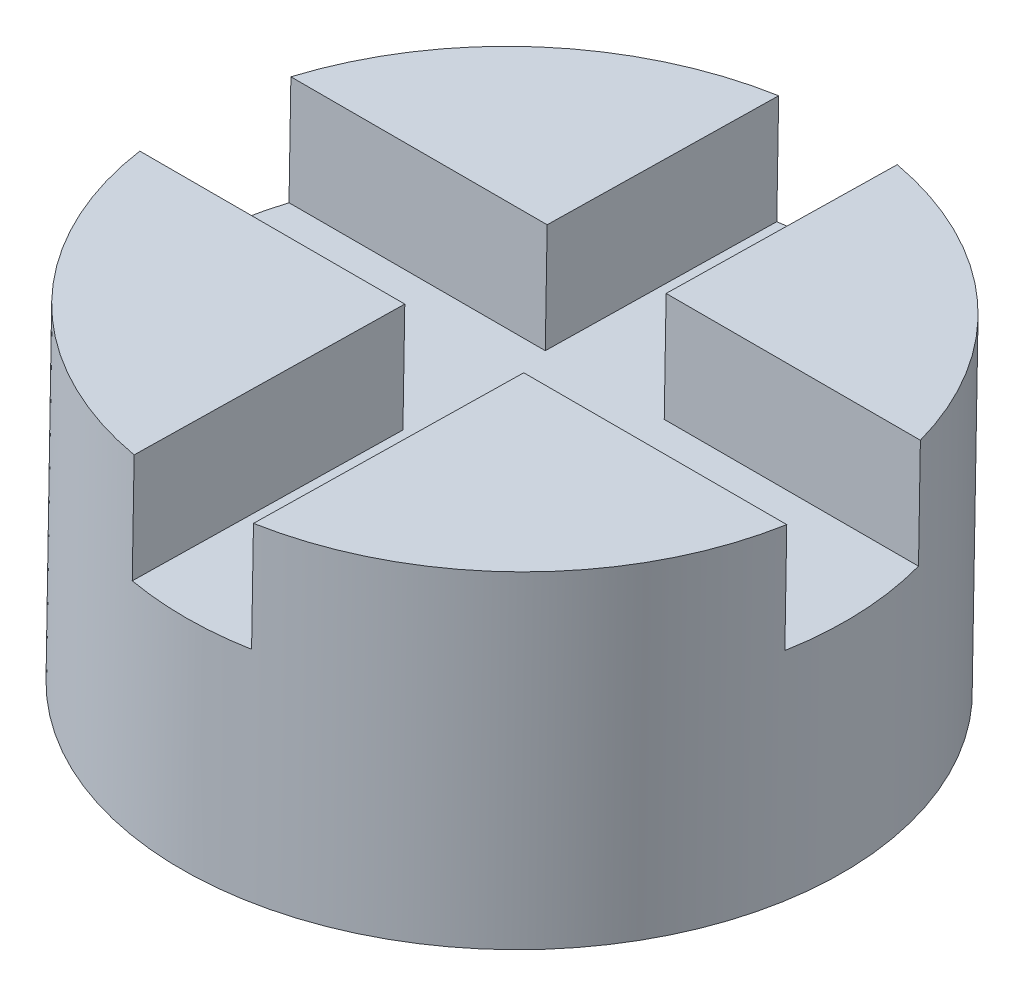
ISO-10303-21;
HEADER;
FILE_DESCRIPTION(('STEP AP214'),'2;1');
FILE_NAME('part.step','',(''),(''),'','','');
FILE_SCHEMA(('AUTOMOTIVE_DESIGN { 1 0 10303 214 1 1 1 1 }'));
ENDSEC;
DATA;
#1=APPLICATION_CONTEXT('core data for automotive mechanical design processes');
#2=APPLICATION_PROTOCOL_DEFINITION('international standard','automotive_design',2000,#1);
#3=PRODUCT_CONTEXT('',#1,'mechanical');
#4=PRODUCT('Part','Part','',(#3));
#5=PRODUCT_RELATED_PRODUCT_CATEGORY('part','',(#4));
#6=PRODUCT_DEFINITION_FORMATION('','',#4);
#7=PRODUCT_DEFINITION_CONTEXT('part definition',#1,'design');
#8=PRODUCT_DEFINITION('design','',#6,#7);
#9=PRODUCT_DEFINITION_SHAPE('','',#8);
#10=(LENGTH_UNIT() NAMED_UNIT(*) SI_UNIT(.MILLI.,.METRE.));
#11=(NAMED_UNIT(*) PLANE_ANGLE_UNIT() SI_UNIT($,.RADIAN.));
#12=(NAMED_UNIT(*) SI_UNIT($,.STERADIAN.) SOLID_ANGLE_UNIT());
#13=UNCERTAINTY_MEASURE_WITH_UNIT(LENGTH_MEASURE(1.E-05),#10,'distance_accuracy_value','');
#14=(GEOMETRIC_REPRESENTATION_CONTEXT(3) GLOBAL_UNCERTAINTY_ASSIGNED_CONTEXT((#13)) GLOBAL_UNIT_ASSIGNED_CONTEXT((#10,
#11,#12)) REPRESENTATION_CONTEXT('',''));
#15=CARTESIAN_POINT('',(0.,0.,0.));
#16=DIRECTION('',(0.,0.,1.));
#17=DIRECTION('',(1.,0.,0.));
#18=AXIS2_PLACEMENT_3D('',#15,#16,#17);
#19=CARTESIAN_POINT('',(0.,42.7310366721,-0.7458730195362));
#20=DIRECTION('',(0.,0.999847695156402,-0.01745240643669));
#21=DIRECTION('',(0.,0.01745240643669,0.999847695156402));
#22=AXIS2_PLACEMENT_3D('',#19,#20,#21);
#23=PLANE('',#22);
#24=DIRECTION('',(1.,0.,0.));
#25=VECTOR('',#24,1.);
#26=CARTESIAN_POINT('',(88.15,42.50416011332,-13.7436223674126));
#27=LINE('',#26,#25);
#28=CARTESIAN_POINT('',(88.15,42.50416011332,-13.7436223674109));
#29=VERTEX_POINT('',#28);
#30=CARTESIAN_POINT('',(85.7803241392514,42.5041601133196,-13.7436223674126));
#31=VERTEX_POINT('',#30);
#32=EDGE_CURVE('E183',#29,#31,#27,.F.);
#33=ORIENTED_EDGE('',*,*,#32,.T.);
#34=CARTESIAN_POINT('',(88.69069436393,42.5188085060638,-12.9044165093134));
#35=DIRECTION('',(0.,-0.999847695156402,0.01745240643669));
#36=DIRECTION('',(0.,-0.01745240643669,-0.999847695156402));
#37=AXIS2_PLACEMENT_3D('',#34,#35,#36);
#38=CIRCLE('',#37,3.02898264973);
#39=CARTESIAN_POINT('',(85.6995442590228,42.52713747285,-12.4272503216927));
#40=VERTEX_POINT('',#39);
#41=EDGE_CURVE('E228',#31,#40,#38,.F.);
#42=ORIENTED_EDGE('',*,*,#41,.T.);
#43=DIRECTION('',(1.,0.,0.));
#44=VECTOR('',#43,1.);
#45=CARTESIAN_POINT('',(85.57217889833,42.52713747285,-12.4272503216927));
#46=LINE('',#45,#44);
#47=CARTESIAN_POINT('',(88.15,42.52713747285,-12.4272503216927));
#48=VERTEX_POINT('',#47);
#49=EDGE_CURVE('E187',#40,#48,#46,.T.);
#50=ORIENTED_EDGE('',*,*,#49,.T.);
#51=DIRECTION('',(0.,0.0174524064389067,0.999847695156363));
#52=VECTOR('',#51,1.);
#53=CARTESIAN_POINT('',(88.15,42.52713747285,-12.42725032169));
#54=LINE('',#53,#52);
#55=CARTESIAN_POINT('',(88.15,42.5708224909701,-9.92453730999004));
#56=VERTEX_POINT('',#55);
#57=EDGE_CURVE('E195',#48,#56,#54,.T.);
#58=ORIENTED_EDGE('',*,*,#57,.T.);
#59=CARTESIAN_POINT('',(88.69069436393,42.5188085060661,-12.9044165093134));
#60=DIRECTION('',(0.,-0.999847695156402,0.01745240643669));
#61=DIRECTION('',(0.,-0.01745240643669,-0.999847695156402));
#62=AXIS2_PLACEMENT_3D('',#59,#60,#61);
#63=CIRCLE('',#62,3.02898264973);
#64=CARTESIAN_POINT('',(89.25,42.5707625146614,-9.9279733503033));
#65=VERTEX_POINT('',#64);
#66=EDGE_CURVE('E19',#56,#65,#63,.F.);
#67=ORIENTED_EDGE('',*,*,#66,.T.);
#68=DIRECTION('',(0.,-0.0174524064376192,-0.999847695156385));
#69=VECTOR('',#68,1.);
#70=CARTESIAN_POINT('',(89.25,42.57076251466,-9.927973350303));
#71=LINE('',#70,#69);
#72=CARTESIAN_POINT('',(89.25,42.52713747285,-12.4272503216909));
#73=VERTEX_POINT('',#72);
#74=EDGE_CURVE('E198',#65,#73,#71,.T.);
#75=ORIENTED_EDGE('',*,*,#74,.T.);
#76=DIRECTION('',(1.,0.,0.));
#77=VECTOR('',#76,1.);
#78=CARTESIAN_POINT('',(89.25,42.52713747285,-12.4272503216927));
#79=LINE('',#78,#77);
#80=CARTESIAN_POINT('',(91.6818444688322,42.527137472848,-12.4272503216927));
#81=VERTEX_POINT('',#80);
#82=EDGE_CURVE('E91',#73,#81,#79,.T.);
#83=ORIENTED_EDGE('',*,*,#82,.T.);
#84=CARTESIAN_POINT('',(88.69069436393,42.5188085060607,-12.9044165093133));
#85=DIRECTION('',(0.,-0.999847695156402,0.01745240643669));
#86=DIRECTION('',(0.,-0.01745240643669,-0.999847695156402));
#87=AXIS2_PLACEMENT_3D('',#84,#85,#86);
#88=CIRCLE('',#87,3.02898264973);
#89=CARTESIAN_POINT('',(91.6010645886036,42.50416011332,-13.7436223674126));
#90=VERTEX_POINT('',#89);
#91=EDGE_CURVE('E243',#81,#90,#88,.F.);
#92=ORIENTED_EDGE('',*,*,#91,.T.);
#93=DIRECTION('',(1.,0.,0.));
#94=VECTOR('',#93,1.);
#95=CARTESIAN_POINT('',(91.77834829332,42.50416011332,-13.7436223674126));
#96=LINE('',#95,#94);
#97=CARTESIAN_POINT('',(89.25,42.50416011332,-13.7436223674126));
#98=VERTEX_POINT('',#97);
#99=EDGE_CURVE('E129',#90,#98,#96,.F.);
#100=ORIENTED_EDGE('',*,*,#99,.T.);
#101=DIRECTION('',(0.,-0.017452406435228,-0.999847695156427));
#102=VECTOR('',#101,1.);
#103=CARTESIAN_POINT('',(89.25,42.50416011332,-13.74362236741));
#104=LINE('',#103,#102);
#105=CARTESIAN_POINT('',(89.25,42.466854497469,-15.8808596683216));
#106=VERTEX_POINT('',#105);
#107=EDGE_CURVE('E126',#98,#106,#104,.T.);
#108=ORIENTED_EDGE('',*,*,#107,.T.);
#109=CARTESIAN_POINT('',(88.69069436393,42.5188085060607,-12.9044165093133));
#110=DIRECTION('',(0.,-0.999847695156402,0.01745240643669));
#111=DIRECTION('',(0.,-0.01745240643669,-0.999847695156402));
#112=AXIS2_PLACEMENT_3D('',#109,#110,#111);
#113=CIRCLE('',#112,3.02898264973);
#114=CARTESIAN_POINT('',(88.15,42.46679452116,-15.8842957086379));
#115=VERTEX_POINT('',#114);
#116=EDGE_CURVE('E242',#106,#115,#113,.F.);
#117=ORIENTED_EDGE('',*,*,#116,.T.);
#118=DIRECTION('',(0.,0.0174524064366882,0.999847695156402));
#119=VECTOR('',#118,1.);
#120=CARTESIAN_POINT('',(88.15,42.46679452116,-15.88429570864));
#121=LINE('',#120,#119);
#122=EDGE_CURVE('E175',#115,#29,#121,.T.);
#123=ORIENTED_EDGE('',*,*,#122,.T.);
#124=EDGE_LOOP('',(#33,#42,#50,#58,#67,#75,#83,#92,#100,#108,#117,#123));
#125=FACE_BOUND('',#124,.T.);
#126=ADVANCED_FACE('F16',(#125),#23,.T.);
#127=CARTESIAN_POINT('',(89.25,44.13214754147,-12.45526587665));
#128=DIRECTION('',(0.,0.01745240643669,0.999847695156402));
#129=DIRECTION('',(0.,-0.999847695156402,0.01745240643669));
#130=AXIS2_PLACEMENT_3D('',#127,#128,#129);
#131=PLANE('',#130);
#132=ORIENTED_EDGE('',*,*,#82,.F.);
#133=DIRECTION('',(0.,0.999847695156345,-0.0174524064399371));
#134=VECTOR('',#133,1.);
#135=CARTESIAN_POINT('',(89.25,42.52713747285,-12.42725032169));
#136=LINE('',#135,#134);
#137=CARTESIAN_POINT('',(89.25,43.5269851680068,-12.4447027281299));
#138=VERTEX_POINT('',#137);
#139=EDGE_CURVE('E200',#73,#138,#136,.T.);
#140=ORIENTED_EDGE('',*,*,#139,.T.);
#141=DIRECTION('',(1.,0.,0.));
#142=VECTOR('',#141,1.);
#143=CARTESIAN_POINT('',(0.,43.5269851680068,-12.4447027281299));
#144=LINE('',#143,#142);
#145=CARTESIAN_POINT('',(91.6818444688322,43.5269851680084,-12.4447027281298));
#146=VERTEX_POINT('',#145);
#147=EDGE_CURVE('E128',#146,#138,#144,.F.);
#148=ORIENTED_EDGE('',*,*,#147,.F.);
#149=DIRECTION('',(0.,-0.999847695156402,0.01745240643669));
#150=VECTOR('',#149,1.);
#151=CARTESIAN_POINT('',(91.68184446883,44.13214754147,-12.45526587665));
#152=LINE('',#151,#150);
#153=EDGE_CURVE('E199',#81,#146,#152,.F.);
#154=ORIENTED_EDGE('',*,*,#153,.F.);
#155=EDGE_LOOP('',(#132,#140,#148,#154));
#156=FACE_BOUND('',#155,.T.);
#157=ADVANCED_FACE('F255',(#156),#131,.F.);
#158=CARTESIAN_POINT('',(89.25,44.17865705882,-9.790737412431));
#159=DIRECTION('',(1.,0.,0.));
#160=DIRECTION('',(0.,0.,-1.));
#161=AXIS2_PLACEMENT_3D('',#158,#159,#160);
#162=PLANE('',#161);
#163=ORIENTED_EDGE('',*,*,#74,.F.);
#164=DIRECTION('',(0.,-0.999847695156394,0.0174524064371114));
#165=VECTOR('',#164,1.);
#166=CARTESIAN_POINT('',(89.25,43.57061020981,-9.94542575674));
#167=LINE('',#166,#165);
#168=CARTESIAN_POINT('',(89.25,43.5706102098161,-9.94542575674011));
#169=VERTEX_POINT('',#168);
#170=EDGE_CURVE('E196',#169,#65,#167,.T.);
#171=ORIENTED_EDGE('',*,*,#170,.F.);
#172=DIRECTION('',(0.,0.01745240643669,0.999847695156402));
#173=VECTOR('',#172,1.);
#174=CARTESIAN_POINT('',(89.25,43.73088436726,-0.7633254259729));
#175=LINE('',#174,#173);
#176=EDGE_CURVE('E157',#138,#169,#175,.T.);
#177=ORIENTED_EDGE('',*,*,#176,.F.);
#178=ORIENTED_EDGE('',*,*,#139,.F.);
#179=EDGE_LOOP('',(#163,#171,#177,#178));
#180=FACE_BOUND('',#179,.T.);
#181=ADVANCED_FACE('F247',(#180),#162,.F.);
#182=CARTESIAN_POINT('',(88.15,44.13214754147,-12.45526587665));
#183=DIRECTION('',(-1.,0.,0.));
#184=DIRECTION('',(0.,0.,1.));
#185=AXIS2_PLACEMENT_3D('',#182,#183,#184);
#186=PLANE('',#185);
#187=ORIENTED_EDGE('',*,*,#57,.F.);
#188=DIRECTION('',(0.,-0.999847695156402,0.01745240643669));
#189=VECTOR('',#188,1.);
#190=CARTESIAN_POINT('',(88.15,44.13214754147,-12.45526587665));
#191=LINE('',#190,#189);
#192=CARTESIAN_POINT('',(88.15,43.5269851680068,-12.4447027281298));
#193=VERTEX_POINT('',#192);
#194=EDGE_CURVE('E189',#48,#193,#191,.F.);
#195=ORIENTED_EDGE('',*,*,#194,.T.);
#196=DIRECTION('',(0.,0.01745240643669,0.999847695156402));
#197=VECTOR('',#196,1.);
#198=CARTESIAN_POINT('',(88.15,43.73088436726,-0.7633254259729));
#199=LINE('',#198,#197);
#200=CARTESIAN_POINT('',(88.15,43.5706701861206,-9.94198971642633));
#201=VERTEX_POINT('',#200);
#202=EDGE_CURVE('E153',#201,#193,#199,.F.);
#203=ORIENTED_EDGE('',*,*,#202,.F.);
#204=DIRECTION('',(0.,0.999847695156412,-0.0174524064361125));
#205=VECTOR('',#204,1.);
#206=CARTESIAN_POINT('',(88.15,42.57082249097,-9.924537309989));
#207=LINE('',#206,#205);
#208=EDGE_CURVE('E188',#56,#201,#207,.T.);
#209=ORIENTED_EDGE('',*,*,#208,.F.);
#210=EDGE_LOOP('',(#187,#195,#203,#209));
#211=FACE_BOUND('',#210,.T.);
#212=ADVANCED_FACE('F262',(#211),#186,.F.);
#213=CARTESIAN_POINT('',(85.57217889833,44.13214754147,-12.45526587665));
#214=DIRECTION('',(0.,0.01745240643669,0.999847695156402));
#215=DIRECTION('',(0.,-0.999847695156402,0.01745240643669));
#216=AXIS2_PLACEMENT_3D('',#213,#214,#215);
#217=PLANE('',#216);
#218=ORIENTED_EDGE('',*,*,#49,.F.);
#219=DIRECTION('',(0.,-0.999847695156402,0.01745240643669));
#220=VECTOR('',#219,1.);
#221=CARTESIAN_POINT('',(85.69954425902,44.13214754147,-12.45526587665));
#222=LINE('',#221,#220);
#223=CARTESIAN_POINT('',(85.6995442590228,43.5269851680061,-12.4447027281298));
#224=VERTEX_POINT('',#223);
#225=EDGE_CURVE('E184',#224,#40,#222,.T.);
#226=ORIENTED_EDGE('',*,*,#225,.F.);
#227=DIRECTION('',(1.,0.,0.));
#228=VECTOR('',#227,1.);
#229=CARTESIAN_POINT('',(0.,43.5269851680068,-12.4447027281299));
#230=LINE('',#229,#228);
#231=EDGE_CURVE('E148',#193,#224,#230,.F.);
#232=ORIENTED_EDGE('',*,*,#231,.F.);
#233=ORIENTED_EDGE('',*,*,#194,.F.);
#234=EDGE_LOOP('',(#218,#226,#232,#233));
#235=FACE_BOUND('',#234,.T.);
#236=ADVANCED_FACE('F297',(#235),#217,.F.);
#237=CARTESIAN_POINT('',(88.15,44.10917018195,-13.77163792237));
#238=DIRECTION('',(0.,-0.01745240643669,-0.999847695156402));
#239=DIRECTION('',(0.,0.999847695156402,-0.01745240643669));
#240=AXIS2_PLACEMENT_3D('',#237,#238,#239);
#241=PLANE('',#240);
#242=ORIENTED_EDGE('',*,*,#32,.F.);
#243=DIRECTION('',(0.,0.999847695156345,-0.0174524064399354));
#244=VECTOR('',#243,1.);
#245=CARTESIAN_POINT('',(88.15,42.50416011332,-13.74362236741));
#246=LINE('',#245,#244);
#247=CARTESIAN_POINT('',(88.15,43.5040078084798,-13.76107477385));
#248=VERTEX_POINT('',#247);
#249=EDGE_CURVE('E177',#29,#248,#246,.T.);
#250=ORIENTED_EDGE('',*,*,#249,.T.);
#251=DIRECTION('',(1.,0.,0.));
#252=VECTOR('',#251,1.);
#253=CARTESIAN_POINT('',(0.,43.5040078084798,-13.76107477385));
#254=LINE('',#253,#252);
#255=CARTESIAN_POINT('',(85.7803241392515,43.50400780848,-13.7610747738497));
#256=VERTEX_POINT('',#255);
#257=EDGE_CURVE('E144',#256,#248,#254,.T.);
#258=ORIENTED_EDGE('',*,*,#257,.F.);
#259=DIRECTION('',(0.,0.999847695156402,-0.01745240643669));
#260=VECTOR('',#259,1.);
#261=CARTESIAN_POINT('',(85.78032413925,44.10917018195,-13.77163792237));
#262=LINE('',#261,#260);
#263=EDGE_CURVE('E176',#31,#256,#262,.T.);
#264=ORIENTED_EDGE('',*,*,#263,.F.);
#265=EDGE_LOOP('',(#242,#250,#258,#264));
#266=FACE_BOUND('',#265,.T.);
#267=ADVANCED_FACE('F293',(#266),#241,.F.);
#268=CARTESIAN_POINT('',(88.15,44.06883212477,-16.08260367049));
#269=DIRECTION('',(-1.,0.,0.));
#270=DIRECTION('',(0.,0.,1.));
#271=AXIS2_PLACEMENT_3D('',#268,#269,#270);
#272=PLANE('',#271);
#273=ORIENTED_EDGE('',*,*,#122,.F.);
#274=DIRECTION('',(0.,-0.99984769515652,0.0174524064299377));
#275=VECTOR('',#274,1.);
#276=CARTESIAN_POINT('',(88.15,43.46664221632,-15.90174811507));
#277=LINE('',#276,#275);
#278=CARTESIAN_POINT('',(88.15,43.4666422163201,-15.9017481150713));
#279=VERTEX_POINT('',#278);
#280=EDGE_CURVE('E172',#279,#115,#277,.T.);
#281=ORIENTED_EDGE('',*,*,#280,.F.);
#282=DIRECTION('',(0.,0.01745240643669,0.999847695156402));
#283=VECTOR('',#282,1.);
#284=CARTESIAN_POINT('',(88.15,43.73088436726,-0.7633254259729));
#285=LINE('',#284,#283);
#286=EDGE_CURVE('E120',#248,#279,#285,.F.);
#287=ORIENTED_EDGE('',*,*,#286,.F.);
#288=ORIENTED_EDGE('',*,*,#249,.F.);
#289=EDGE_LOOP('',(#273,#281,#287,#288));
#290=FACE_BOUND('',#289,.T.);
#291=ADVANCED_FACE('F290',(#290),#272,.F.);
#292=CARTESIAN_POINT('',(89.25,44.10917018195,-13.77163792237));
#293=DIRECTION('',(1.,0.,0.));
#294=DIRECTION('',(0.,0.,-1.));
#295=AXIS2_PLACEMENT_3D('',#292,#293,#294);
#296=PLANE('',#295);
#297=ORIENTED_EDGE('',*,*,#107,.F.);
#298=DIRECTION('',(0.,0.999847695156402,-0.01745240643669));
#299=VECTOR('',#298,1.);
#300=CARTESIAN_POINT('',(89.25,44.10917018195,-13.77163792237));
#301=LINE('',#300,#299);
#302=CARTESIAN_POINT('',(89.25,43.5040078084798,-13.7610747738498));
#303=VERTEX_POINT('',#302);
#304=EDGE_CURVE('E123',#98,#303,#301,.T.);
#305=ORIENTED_EDGE('',*,*,#304,.T.);
#306=DIRECTION('',(0.,0.01745240643669,0.999847695156402));
#307=VECTOR('',#306,1.);
#308=CARTESIAN_POINT('',(89.25,43.73088436726,-0.7633254259729));
#309=LINE('',#308,#307);
#310=CARTESIAN_POINT('',(89.25,43.4667021926284,-15.89831207476));
#311=VERTEX_POINT('',#310);
#312=EDGE_CURVE('E113',#311,#303,#309,.T.);
#313=ORIENTED_EDGE('',*,*,#312,.F.);
#314=DIRECTION('',(0.,0.999847695156345,-0.017452406439937));
#315=VECTOR('',#314,1.);
#316=CARTESIAN_POINT('',(89.25,42.46685449747,-15.88085966832));
#317=LINE('',#316,#315);
#318=EDGE_CURVE('E167',#106,#311,#317,.T.);
#319=ORIENTED_EDGE('',*,*,#318,.F.);
#320=EDGE_LOOP('',(#297,#305,#313,#319));
#321=FACE_BOUND('',#320,.T.);
#322=ADVANCED_FACE('F124',(#321),#296,.F.);
#323=CARTESIAN_POINT('',(91.77834829332,44.10917018195,-13.77163792237));
#324=DIRECTION('',(0.,-0.01745240643669,-0.999847695156402));
#325=DIRECTION('',(0.,0.999847695156402,-0.01745240643669));
#326=AXIS2_PLACEMENT_3D('',#323,#324,#325);
#327=PLANE('',#326);
#328=ORIENTED_EDGE('',*,*,#99,.F.);
#329=DIRECTION('',(0.,0.999847695156402,-0.01745240643669));
#330=VECTOR('',#329,1.);
#331=CARTESIAN_POINT('',(91.6010645886,44.10917018195,-13.77163792237));
#332=LINE('',#331,#330);
#333=CARTESIAN_POINT('',(91.6010645886035,43.5040078084815,-13.7610747738499));
#334=VERTEX_POINT('',#333);
#335=EDGE_CURVE('E34',#334,#90,#332,.F.);
#336=ORIENTED_EDGE('',*,*,#335,.F.);
#337=DIRECTION('',(1.,0.,0.));
#338=VECTOR('',#337,1.);
#339=CARTESIAN_POINT('',(0.,43.5040078084798,-13.76107477385));
#340=LINE('',#339,#338);
#341=EDGE_CURVE('E116',#303,#334,#340,.T.);
#342=ORIENTED_EDGE('',*,*,#341,.F.);
#343=ORIENTED_EDGE('',*,*,#304,.F.);
#344=EDGE_LOOP('',(#328,#336,#342,#343));
#345=FACE_BOUND('',#344,.T.);
#346=ADVANCED_FACE('F131',(#345),#327,.F.);
#347=CARTESIAN_POINT('',(0.,43.73088436726,-0.7633254259729));
#348=DIRECTION('',(0.,0.999847695156402,-0.01745240643669));
#349=DIRECTION('',(0.,0.01745240643669,0.999847695156402));
#350=AXIS2_PLACEMENT_3D('',#347,#348,#349);
#351=PLANE('',#350);
#352=ORIENTED_EDGE('',*,*,#147,.T.);
#353=ORIENTED_EDGE('',*,*,#176,.T.);
#354=CARTESIAN_POINT('',(88.69069436393,43.5186562012238,-12.9218689157502));
#355=DIRECTION('',(0.,-0.999847695156402,0.01745240643669));
#356=DIRECTION('',(0.,-0.01745240643669,-0.999847695156402));
#357=AXIS2_PLACEMENT_3D('',#354,#355,#356);
#358=CIRCLE('',#357,3.02898264973);
#359=EDGE_CURVE('E132',#146,#169,#358,.T.);
#360=ORIENTED_EDGE('',*,*,#359,.F.);
#361=EDGE_LOOP('',(#352,#353,#360));
#362=FACE_BOUND('',#361,.T.);
#363=ADVANCED_FACE('F254',(#362),#351,.T.);
#364=CARTESIAN_POINT('',(0.,43.73088436726,-0.7633254259729));
#365=DIRECTION('',(0.,0.999847695156402,-0.01745240643669));
#366=DIRECTION('',(0.,0.01745240643669,0.999847695156402));
#367=AXIS2_PLACEMENT_3D('',#364,#365,#366);
#368=PLANE('',#367);
#369=ORIENTED_EDGE('',*,*,#202,.T.);
#370=ORIENTED_EDGE('',*,*,#231,.T.);
#371=CARTESIAN_POINT('',(88.69069436393,43.5186562012193,-12.9218689157501));
#372=DIRECTION('',(0.,-0.999847695156402,0.01745240643669));
#373=DIRECTION('',(0.,-0.01745240643669,-0.999847695156402));
#374=AXIS2_PLACEMENT_3D('',#371,#372,#373);
#375=CIRCLE('',#374,3.02898264973);
#376=EDGE_CURVE('E135',#201,#224,#375,.T.);
#377=ORIENTED_EDGE('',*,*,#376,.F.);
#378=EDGE_LOOP('',(#369,#370,#377));
#379=FACE_BOUND('',#378,.T.);
#380=ADVANCED_FACE('F279',(#379),#368,.T.);
#381=CARTESIAN_POINT('',(0.,43.73088436726,-0.7633254259729));
#382=DIRECTION('',(0.,0.999847695156402,-0.01745240643669));
#383=DIRECTION('',(0.,0.01745240643669,0.999847695156402));
#384=AXIS2_PLACEMENT_3D('',#381,#382,#383);
#385=PLANE('',#384);
#386=ORIENTED_EDGE('',*,*,#257,.T.);
#387=ORIENTED_EDGE('',*,*,#286,.T.);
#388=CARTESIAN_POINT('',(88.69069436393,43.5186562012208,-12.9218689157501));
#389=DIRECTION('',(0.,-0.999847695156402,0.01745240643669));
#390=DIRECTION('',(0.,-0.01745240643669,-0.999847695156402));
#391=AXIS2_PLACEMENT_3D('',#388,#389,#390);
#392=CIRCLE('',#391,3.02898264973);
#393=EDGE_CURVE('E236',#256,#279,#392,.T.);
#394=ORIENTED_EDGE('',*,*,#393,.F.);
#395=EDGE_LOOP('',(#386,#387,#394));
#396=FACE_BOUND('',#395,.T.);
#397=ADVANCED_FACE('F276',(#396),#385,.T.);
#398=CARTESIAN_POINT('',(0.,43.73088436726,-0.7633254259729));
#399=DIRECTION('',(0.,0.999847695156402,-0.01745240643669));
#400=DIRECTION('',(0.,0.01745240643669,0.999847695156402));
#401=AXIS2_PLACEMENT_3D('',#398,#399,#400);
#402=PLANE('',#401);
#403=ORIENTED_EDGE('',*,*,#312,.T.);
#404=ORIENTED_EDGE('',*,*,#341,.T.);
#405=CARTESIAN_POINT('',(88.69069436393,43.5186562012239,-12.9218689157502));
#406=DIRECTION('',(0.,-0.999847695156402,0.01745240643669));
#407=DIRECTION('',(0.,-0.01745240643669,-0.999847695156402));
#408=AXIS2_PLACEMENT_3D('',#405,#406,#407);
#409=CIRCLE('',#408,3.02898264973);
#410=EDGE_CURVE('E25',#311,#334,#409,.T.);
#411=ORIENTED_EDGE('',*,*,#410,.F.);
#412=EDGE_LOOP('',(#403,#404,#411));
#413=FACE_BOUND('',#412,.T.);
#414=ADVANCED_FACE('F115',(#413),#402,.T.);
#415=CARTESIAN_POINT('',(88.69069436393,40.51911311575,-12.86951169644));
#416=DIRECTION('',(0.,-0.999847695156402,0.01745240643669));
#417=DIRECTION('',(0.,-0.01745240643669,-0.999847695156402));
#418=AXIS2_PLACEMENT_3D('',#415,#416,#417);
#419=CYLINDRICAL_SURFACE('',#418,3.02898264973);
#420=ORIENTED_EDGE('',*,*,#41,.F.);
#421=ORIENTED_EDGE('',*,*,#263,.T.);
#422=ORIENTED_EDGE('',*,*,#393,.T.);
#423=ORIENTED_EDGE('',*,*,#280,.T.);
#424=ORIENTED_EDGE('',*,*,#116,.F.);
#425=ORIENTED_EDGE('',*,*,#318,.T.);
#426=ORIENTED_EDGE('',*,*,#410,.T.);
#427=ORIENTED_EDGE('',*,*,#335,.T.);
#428=ORIENTED_EDGE('',*,*,#91,.F.);
#429=ORIENTED_EDGE('',*,*,#153,.T.);
#430=ORIENTED_EDGE('',*,*,#359,.T.);
#431=ORIENTED_EDGE('',*,*,#170,.T.);
#432=ORIENTED_EDGE('',*,*,#66,.F.);
#433=ORIENTED_EDGE('',*,*,#208,.T.);
#434=ORIENTED_EDGE('',*,*,#376,.T.);
#435=ORIENTED_EDGE('',*,*,#225,.T.);
#436=EDGE_LOOP('',(#420,#421,#422,#423,#424,#425,#426,#427,#428,#429,#430,#431,#432,#433,#434,#435));
#437=FACE_BOUND('',#436,.T.);
#438=CARTESIAN_POINT('',(88.69069436393,40.51911311575,-12.86951169644));
#439=DIRECTION('',(0.,-0.999847695156402,0.01745240643669));
#440=DIRECTION('',(0.,-0.01745240643669,-0.999847695156402));
#441=AXIS2_PLACEMENT_3D('',#438,#439,#440);
#442=CIRCLE('',#441,3.02898264973);
#443=CARTESIAN_POINT('',(88.69069436393,40.4662500794572,-15.8980330174413));
#444=VERTEX_POINT('',#443);
#445=EDGE_CURVE('E11',#444,#444,#442,.F.);
#446=ORIENTED_EDGE('',*,*,#445,.T.);
#447=EDGE_LOOP('',(#446));
#448=FACE_BOUND('',#447,.T.);
#449=ADVANCED_FACE('F249',(#437,#448),#419,.T.);
#450=CARTESIAN_POINT('',(0.,40.73134128179,-0.7109682066629));
#451=DIRECTION('',(0.,0.999847695156402,-0.01745240643669));
#452=DIRECTION('',(0.,0.01745240643669,0.999847695156402));
#453=AXIS2_PLACEMENT_3D('',#450,#451,#452);
#454=PLANE('',#453);
#455=ORIENTED_EDGE('',*,*,#445,.F.);
#456=EDGE_LOOP('',(#455));
#457=FACE_BOUND('',#456,.T.);
#458=ADVANCED_FACE('F264',(#457),#454,.F.);
#459=CLOSED_SHELL('',(#126,#157,#181,#212,#236,#267,#291,#322,#346,#363,#380,#397,#414,#449,#458));
#460=MANIFOLD_SOLID_BREP('B1',#459);
#461=ADVANCED_BREP_SHAPE_REPRESENTATION('',(#18,#460),#14);
#462=SHAPE_DEFINITION_REPRESENTATION(#9,#461);
ENDSEC;
END-ISO-10303-21;
